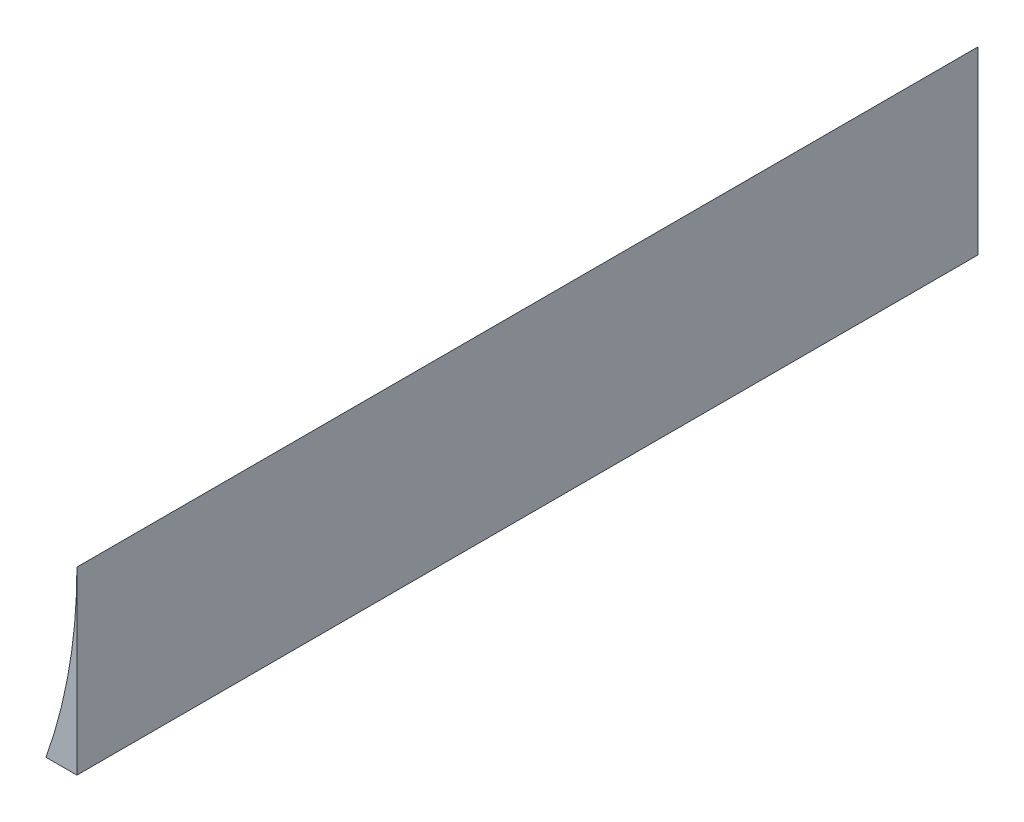
ISO-10303-21;
HEADER;
FILE_DESCRIPTION(('STEP AP214'),'2;1');
FILE_NAME('part.step','',(''),(''),'','','');
FILE_SCHEMA(('AUTOMOTIVE_DESIGN { 1 0 10303 214 1 1 1 1 }'));
ENDSEC;
DATA;
#1=APPLICATION_CONTEXT('core data for automotive mechanical design processes');
#2=APPLICATION_PROTOCOL_DEFINITION('international standard','automotive_design',2000,#1);
#3=PRODUCT_CONTEXT('',#1,'mechanical');
#4=PRODUCT('Part','Part','',(#3));
#5=PRODUCT_RELATED_PRODUCT_CATEGORY('part','',(#4));
#6=PRODUCT_DEFINITION_FORMATION('','',#4);
#7=PRODUCT_DEFINITION_CONTEXT('part definition',#1,'design');
#8=PRODUCT_DEFINITION('design','',#6,#7);
#9=PRODUCT_DEFINITION_SHAPE('','',#8);
#10=(LENGTH_UNIT() NAMED_UNIT(*) SI_UNIT(.MILLI.,.METRE.));
#11=(NAMED_UNIT(*) PLANE_ANGLE_UNIT() SI_UNIT($,.RADIAN.));
#12=(NAMED_UNIT(*) SI_UNIT($,.STERADIAN.) SOLID_ANGLE_UNIT());
#13=UNCERTAINTY_MEASURE_WITH_UNIT(LENGTH_MEASURE(1.E-05),#10,'distance_accuracy_value','');
#14=(GEOMETRIC_REPRESENTATION_CONTEXT(3) GLOBAL_UNCERTAINTY_ASSIGNED_CONTEXT((#13)) GLOBAL_UNIT_ASSIGNED_CONTEXT((#10,
#11,#12)) REPRESENTATION_CONTEXT('',''));
#15=CARTESIAN_POINT('',(0.,0.,0.));
#16=DIRECTION('',(0.,0.,1.));
#17=DIRECTION('',(1.,0.,0.));
#18=AXIS2_PLACEMENT_3D('',#15,#16,#17);
#19=CARTESIAN_POINT('',(-31.75,25.4,-15.875));
#20=DIRECTION('',(0.,0.,-1.));
#21=DIRECTION('',(0.,1.,0.));
#22=AXIS2_PLACEMENT_3D('',#19,#20,#21);
#23=PLANE('',#22);
#24=CARTESIAN_POINT('',(0.9525,31.75,-15.875));
#25=DIRECTION('',(0.,0.,-1.));
#26=DIRECTION('',(1.,0.,0.));
#27=AXIS2_PLACEMENT_3D('',#24,#25,#26);
#28=CIRCLE('',#27,19.05);
#29=CARTESIAN_POINT('',(20.0025,31.75,-15.875));
#30=VERTEX_POINT('',#29);
#31=CARTESIAN_POINT('',(18.9130122934536,25.4,-15.875));
#32=VERTEX_POINT('',#31);
#33=EDGE_CURVE('E80',#30,#32,#28,.T.);
#34=ORIENTED_EDGE('',*,*,#33,.F.);
#35=DIRECTION('',(0.,-1.,0.));
#36=VECTOR('',#35,1.);
#37=CARTESIAN_POINT('',(20.0025,25.4,-15.875));
#38=LINE('',#37,#36);
#39=CARTESIAN_POINT('',(20.0025,25.4,-15.875));
#40=VERTEX_POINT('',#39);
#41=EDGE_CURVE('E75',#30,#40,#38,.T.);
#42=ORIENTED_EDGE('',*,*,#41,.T.);
#43=DIRECTION('',(1.,0.,0.));
#44=VECTOR('',#43,1.);
#45=CARTESIAN_POINT('',(0.,25.4,-15.875));
#46=LINE('',#45,#44);
#47=EDGE_CURVE('E49',#32,#40,#46,.T.);
#48=ORIENTED_EDGE('',*,*,#47,.F.);
#49=EDGE_LOOP('',(#34,#42,#48));
#50=FACE_BOUND('',#49,.T.);
#51=ADVANCED_FACE('F41',(#50),#23,.T.);
#52=CARTESIAN_POINT('',(-31.75,25.4,15.875));
#53=DIRECTION('',(0.,0.,-1.));
#54=DIRECTION('',(0.,1.,0.));
#55=AXIS2_PLACEMENT_3D('',#52,#53,#54);
#56=PLANE('',#55);
#57=DIRECTION('',(0.,-1.,0.));
#58=VECTOR('',#57,1.);
#59=CARTESIAN_POINT('',(20.0025,25.4,15.875));
#60=LINE('',#59,#58);
#61=CARTESIAN_POINT('',(20.0025,31.75,15.875));
#62=VERTEX_POINT('',#61);
#63=CARTESIAN_POINT('',(20.0025,25.4,15.875));
#64=VERTEX_POINT('',#63);
#65=EDGE_CURVE('E55',#62,#64,#60,.T.);
#66=ORIENTED_EDGE('',*,*,#65,.F.);
#67=CARTESIAN_POINT('',(20.0025,31.75,15.875));
#68=CARTESIAN_POINT('',(20.0025,28.4815367264149,15.875));
#69=CARTESIAN_POINT('',(18.9130122421383,25.4,15.875));
#70=B_SPLINE_CURVE_WITH_KNOTS('',2,(#67,#68,#69),.UNSPECIFIED.,.F.,.F.,(3,3),(0.,1.),.UNSPECIFIED.);
#71=CARTESIAN_POINT('',(18.9130122421383,25.4,15.875));
#72=VERTEX_POINT('',#71);
#73=EDGE_CURVE('E90',#62,#72,#70,.T.);
#74=ORIENTED_EDGE('',*,*,#73,.T.);
#75=DIRECTION('',(1.,0.,0.));
#76=VECTOR('',#75,1.);
#77=CARTESIAN_POINT('',(-31.75,25.4,15.875));
#78=LINE('',#77,#76);
#79=EDGE_CURVE('E85',#72,#64,#78,.T.);
#80=ORIENTED_EDGE('',*,*,#79,.T.);
#81=EDGE_LOOP('',(#66,#74,#80));
#82=FACE_BOUND('',#81,.T.);
#83=ADVANCED_FACE('F118',(#82),#56,.F.);
#84=CARTESIAN_POINT('',(0.,25.4,0.));
#85=DIRECTION('',(0.,1.,0.));
#86=DIRECTION('',(0.,0.,1.));
#87=AXIS2_PLACEMENT_3D('',#84,#85,#86);
#88=PLANE('',#87);
#89=DIRECTION('',(0.,0.,-1.));
#90=VECTOR('',#89,1.);
#91=CARTESIAN_POINT('',(20.0025,25.4,0.));
#92=LINE('',#91,#90);
#93=EDGE_CURVE('E11',#64,#40,#92,.T.);
#94=ORIENTED_EDGE('',*,*,#93,.F.);
#95=ORIENTED_EDGE('',*,*,#79,.F.);
#96=DIRECTION('',(0.,0.,-1.));
#97=VECTOR('',#96,1.);
#98=CARTESIAN_POINT('',(18.9130122421383,25.4,103.07574));
#99=LINE('',#98,#97);
#100=EDGE_CURVE('E64',#32,#72,#99,.F.);
#101=ORIENTED_EDGE('',*,*,#100,.F.);
#102=ORIENTED_EDGE('',*,*,#47,.T.);
#103=EDGE_LOOP('',(#94,#95,#101,#102));
#104=FACE_BOUND('',#103,.T.);
#105=ADVANCED_FACE('F43',(#104),#88,.F.);
#106=CARTESIAN_POINT('',(0.9525,31.75,103.07574));
#107=DIRECTION('',(0.,0.,-1.));
#108=DIRECTION('',(1.,0.,0.));
#109=AXIS2_PLACEMENT_3D('',#106,#107,#108);
#110=CYLINDRICAL_SURFACE('',#109,19.05);
#111=ORIENTED_EDGE('',*,*,#33,.T.);
#112=ORIENTED_EDGE('',*,*,#100,.T.);
#113=ORIENTED_EDGE('',*,*,#73,.F.);
#114=CARTESIAN_POINT('',(20.0025,31.75,15.875));
#115=DIRECTION('',(0.,0.,-1.));
#116=VECTOR('',#115,1.);
#117=LINE('',#114,#116);
#118=EDGE_CURVE('E97',#62,#30,#117,.T.);
#119=ORIENTED_EDGE('',*,*,#118,.T.);
#120=EDGE_LOOP('',(#111,#112,#113,#119));
#121=FACE_BOUND('',#120,.T.);
#122=ADVANCED_FACE('F107',(#121),#110,.F.);
#123=CARTESIAN_POINT('',(20.0025,0.,0.));
#124=DIRECTION('',(1.,0.,0.));
#125=DIRECTION('',(0.,0.,-1.));
#126=AXIS2_PLACEMENT_3D('',#123,#124,#125);
#127=PLANE('',#126);
#128=ORIENTED_EDGE('',*,*,#118,.F.);
#129=ORIENTED_EDGE('',*,*,#65,.T.);
#130=ORIENTED_EDGE('',*,*,#93,.T.);
#131=ORIENTED_EDGE('',*,*,#41,.F.);
#132=EDGE_LOOP('',(#128,#129,#130,#131));
#133=FACE_BOUND('',#132,.T.);
#134=ADVANCED_FACE('F74',(#133),#127,.T.);
#135=CLOSED_SHELL('',(#51,#83,#105,#122,#134));
#136=MANIFOLD_SOLID_BREP('B2',#135);
#137=ADVANCED_BREP_SHAPE_REPRESENTATION('',(#18,#136),#14);
#138=SHAPE_DEFINITION_REPRESENTATION(#9,#137);
ENDSEC;
END-ISO-10303-21;
